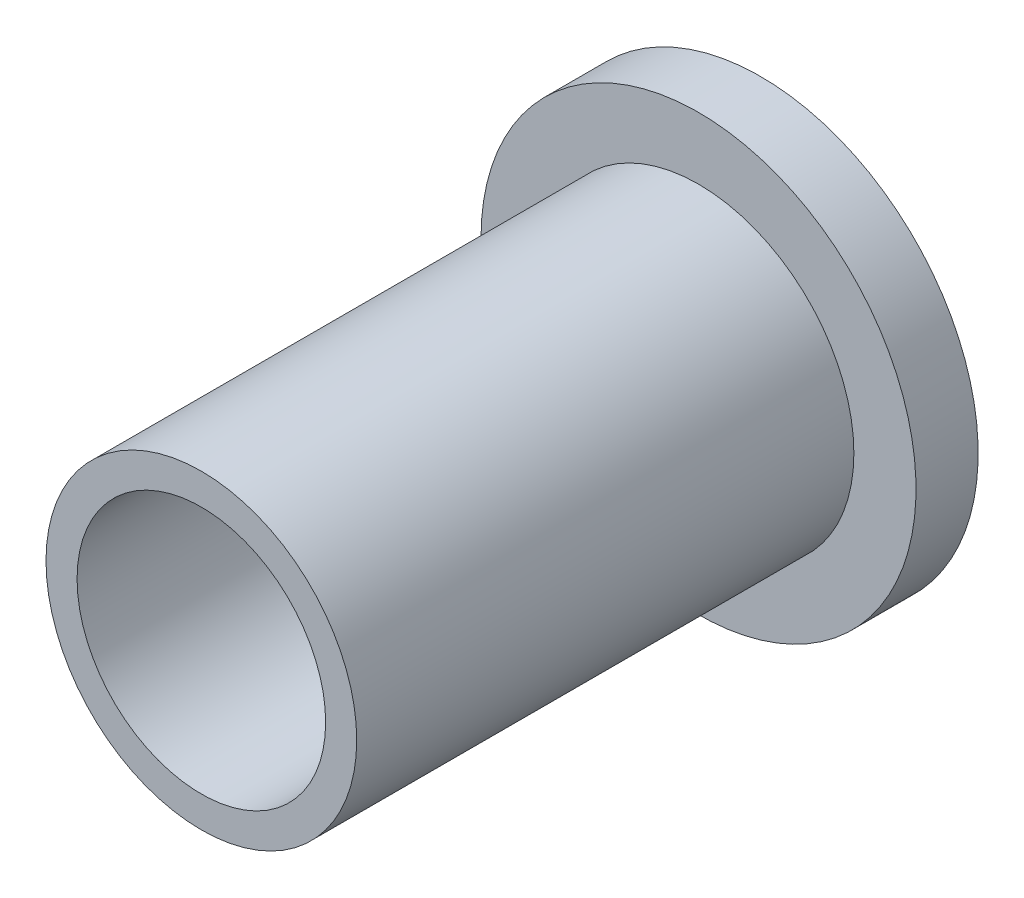
ISO-10303-21;
HEADER;
FILE_DESCRIPTION(('STEP AP214'),'2;1');
FILE_NAME('part.step','',(''),(''),'','','');
FILE_SCHEMA(('AUTOMOTIVE_DESIGN { 1 0 10303 214 1 1 1 1 }'));
ENDSEC;
DATA;
#1=APPLICATION_CONTEXT('core data for automotive mechanical design processes');
#2=APPLICATION_PROTOCOL_DEFINITION('international standard','automotive_design',2000,#1);
#3=PRODUCT_CONTEXT('',#1,'mechanical');
#4=PRODUCT('Part','Part','',(#3));
#5=PRODUCT_RELATED_PRODUCT_CATEGORY('part','',(#4));
#6=PRODUCT_DEFINITION_FORMATION('','',#4);
#7=PRODUCT_DEFINITION_CONTEXT('part definition',#1,'design');
#8=PRODUCT_DEFINITION('design','',#6,#7);
#9=PRODUCT_DEFINITION_SHAPE('','',#8);
#10=(LENGTH_UNIT() NAMED_UNIT(*) SI_UNIT(.MILLI.,.METRE.));
#11=(NAMED_UNIT(*) PLANE_ANGLE_UNIT() SI_UNIT($,.RADIAN.));
#12=(NAMED_UNIT(*) SI_UNIT($,.STERADIAN.) SOLID_ANGLE_UNIT());
#13=UNCERTAINTY_MEASURE_WITH_UNIT(LENGTH_MEASURE(1.E-05),#10,'distance_accuracy_value','');
#14=(GEOMETRIC_REPRESENTATION_CONTEXT(3) GLOBAL_UNCERTAINTY_ASSIGNED_CONTEXT((#13)) GLOBAL_UNIT_ASSIGNED_CONTEXT((#10,
#11,#12)) REPRESENTATION_CONTEXT('',''));
#15=CARTESIAN_POINT('',(0.,0.,0.));
#16=DIRECTION('',(0.,0.,1.));
#17=DIRECTION('',(1.,0.,0.));
#18=AXIS2_PLACEMENT_3D('',#15,#16,#17);
#19=CARTESIAN_POINT('',(0.,0.,25.4));
#20=DIRECTION('',(0.,0.,1.));
#21=DIRECTION('',(1.,0.,0.));
#22=AXIS2_PLACEMENT_3D('',#19,#20,#21);
#23=PLANE('',#22);
#24=CARTESIAN_POINT('',(0.,0.,25.4));
#25=DIRECTION('',(0.,0.,1.));
#26=DIRECTION('',(1.,0.,0.));
#27=AXIS2_PLACEMENT_3D('',#24,#25,#26);
#28=CIRCLE('',#27,7.9375);
#29=CARTESIAN_POINT('',(7.9375,0.,25.4));
#30=VERTEX_POINT('',#29);
#31=EDGE_CURVE('E12',#30,#30,#28,.T.);
#32=ORIENTED_EDGE('',*,*,#31,.T.);
#33=EDGE_LOOP('',(#32));
#34=FACE_BOUND('',#33,.T.);
#35=CARTESIAN_POINT('',(0.,0.,25.4));
#36=DIRECTION('',(0.,0.,1.));
#37=DIRECTION('',(1.,0.,0.));
#38=AXIS2_PLACEMENT_3D('',#35,#36,#37);
#39=CIRCLE('',#38,6.35);
#40=CARTESIAN_POINT('',(6.35,0.,25.4));
#41=VERTEX_POINT('',#40);
#42=EDGE_CURVE('E49',#41,#41,#39,.T.);
#43=ORIENTED_EDGE('',*,*,#42,.F.);
#44=EDGE_LOOP('',(#43));
#45=FACE_BOUND('',#44,.T.);
#46=ADVANCED_FACE('F42',(#34,#45),#23,.T.);
#47=CARTESIAN_POINT('',(0.,0.,25.4));
#48=DIRECTION('',(0.,0.,-1.));
#49=DIRECTION('',(-1.,0.,0.));
#50=AXIS2_PLACEMENT_3D('',#47,#48,#49);
#51=CYLINDRICAL_SURFACE('',#50,7.9375);
#52=ORIENTED_EDGE('',*,*,#31,.F.);
#53=EDGE_LOOP('',(#52));
#54=FACE_BOUND('',#53,.T.);
#55=CARTESIAN_POINT('',(0.,0.,0.));
#56=DIRECTION('',(0.,0.,-1.));
#57=DIRECTION('',(-1.,0.,0.));
#58=AXIS2_PLACEMENT_3D('',#55,#56,#57);
#59=CIRCLE('',#58,7.9375);
#60=CARTESIAN_POINT('',(-7.9375,0.,0.));
#61=VERTEX_POINT('',#60);
#62=EDGE_CURVE('E53',#61,#61,#59,.T.);
#63=ORIENTED_EDGE('',*,*,#62,.F.);
#64=EDGE_LOOP('',(#63));
#65=FACE_BOUND('',#64,.T.);
#66=ADVANCED_FACE('F44',(#54,#65),#51,.T.);
#67=CARTESIAN_POINT('',(0.,0.,25.4));
#68=DIRECTION('',(0.,0.,-1.));
#69=DIRECTION('',(-1.,0.,0.));
#70=AXIS2_PLACEMENT_3D('',#67,#68,#69);
#71=CYLINDRICAL_SURFACE('',#70,6.35);
#72=ORIENTED_EDGE('',*,*,#42,.T.);
#73=EDGE_LOOP('',(#72));
#74=FACE_BOUND('',#73,.T.);
#75=CARTESIAN_POINT('',(0.,0.,-3.175));
#76=DIRECTION('',(0.,0.,-1.));
#77=DIRECTION('',(-1.,0.,0.));
#78=AXIS2_PLACEMENT_3D('',#75,#76,#77);
#79=CIRCLE('',#78,6.35);
#80=CARTESIAN_POINT('',(-6.35,0.,-3.175));
#81=VERTEX_POINT('',#80);
#82=EDGE_CURVE('E63',#81,#81,#79,.T.);
#83=ORIENTED_EDGE('',*,*,#82,.T.);
#84=EDGE_LOOP('',(#83));
#85=FACE_BOUND('',#84,.T.);
#86=ADVANCED_FACE('F69',(#74,#85),#71,.F.);
#87=CARTESIAN_POINT('',(0.,0.,0.));
#88=DIRECTION('',(0.,0.,-1.));
#89=DIRECTION('',(-1.,0.,0.));
#90=AXIS2_PLACEMENT_3D('',#87,#88,#89);
#91=PLANE('',#90);
#92=CARTESIAN_POINT('',(0.,0.,0.));
#93=DIRECTION('',(0.,0.,-1.));
#94=DIRECTION('',(-1.,0.,0.));
#95=AXIS2_PLACEMENT_3D('',#92,#93,#94);
#96=CIRCLE('',#95,11.1125);
#97=CARTESIAN_POINT('',(-11.1125,0.,0.));
#98=VERTEX_POINT('',#97);
#99=EDGE_CURVE('E60',#98,#98,#96,.T.);
#100=ORIENTED_EDGE('',*,*,#99,.F.);
#101=EDGE_LOOP('',(#100));
#102=FACE_BOUND('',#101,.T.);
#103=ORIENTED_EDGE('',*,*,#62,.T.);
#104=EDGE_LOOP('',(#103));
#105=FACE_BOUND('',#104,.T.);
#106=ADVANCED_FACE('F74',(#102,#105),#91,.F.);
#107=CARTESIAN_POINT('',(0.,0.,-3.175));
#108=DIRECTION('',(0.,0.,-1.));
#109=DIRECTION('',(-1.,0.,0.));
#110=AXIS2_PLACEMENT_3D('',#107,#108,#109);
#111=PLANE('',#110);
#112=CARTESIAN_POINT('',(0.,0.,-3.175));
#113=DIRECTION('',(0.,0.,-1.));
#114=DIRECTION('',(-1.,0.,0.));
#115=AXIS2_PLACEMENT_3D('',#112,#113,#114);
#116=CIRCLE('',#115,11.1125);
#117=CARTESIAN_POINT('',(-11.1125,0.,-3.175));
#118=VERTEX_POINT('',#117);
#119=EDGE_CURVE('E57',#118,#118,#116,.T.);
#120=ORIENTED_EDGE('',*,*,#119,.T.);
#121=EDGE_LOOP('',(#120));
#122=FACE_BOUND('',#121,.T.);
#123=ORIENTED_EDGE('',*,*,#82,.F.);
#124=EDGE_LOOP('',(#123));
#125=FACE_BOUND('',#124,.T.);
#126=ADVANCED_FACE('F71',(#122,#125),#111,.T.);
#127=CARTESIAN_POINT('',(0.,0.,-3.175));
#128=DIRECTION('',(0.,0.,1.));
#129=DIRECTION('',(1.,0.,0.));
#130=AXIS2_PLACEMENT_3D('',#127,#128,#129);
#131=CYLINDRICAL_SURFACE('',#130,11.1125);
#132=ORIENTED_EDGE('',*,*,#119,.F.);
#133=EDGE_LOOP('',(#132));
#134=FACE_BOUND('',#133,.T.);
#135=ORIENTED_EDGE('',*,*,#99,.T.);
#136=EDGE_LOOP('',(#135));
#137=FACE_BOUND('',#136,.T.);
#138=ADVANCED_FACE('F73',(#134,#137),#131,.T.);
#139=CLOSED_SHELL('',(#46,#66,#86,#106,#126,#138));
#140=MANIFOLD_SOLID_BREP('B2',#139);
#141=ADVANCED_BREP_SHAPE_REPRESENTATION('',(#18,#140),#14);
#142=SHAPE_DEFINITION_REPRESENTATION(#9,#141);
ENDSEC;
END-ISO-10303-21;
